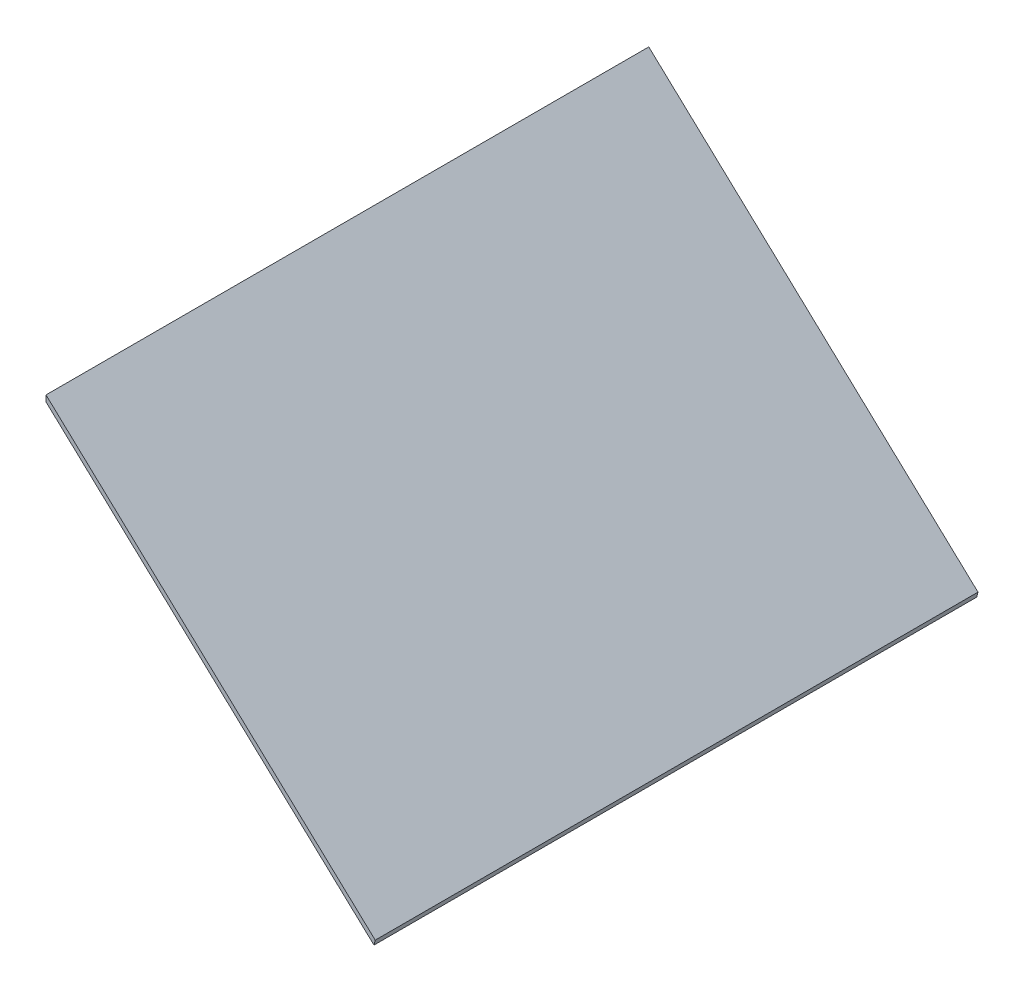
ISO-10303-21;
HEADER;
FILE_DESCRIPTION(('STEP AP214'),'2;1');
FILE_NAME('part.step','',(''),(''),'','','');
FILE_SCHEMA(('AUTOMOTIVE_DESIGN { 1 0 10303 214 1 1 1 1 }'));
ENDSEC;
DATA;
#1=APPLICATION_CONTEXT('core data for automotive mechanical design processes');
#2=APPLICATION_PROTOCOL_DEFINITION('international standard','automotive_design',2000,#1);
#3=PRODUCT_CONTEXT('',#1,'mechanical');
#4=PRODUCT('Part','Part','',(#3));
#5=PRODUCT_RELATED_PRODUCT_CATEGORY('part','',(#4));
#6=PRODUCT_DEFINITION_FORMATION('','',#4);
#7=PRODUCT_DEFINITION_CONTEXT('part definition',#1,'design');
#8=PRODUCT_DEFINITION('design','',#6,#7);
#9=PRODUCT_DEFINITION_SHAPE('','',#8);
#10=(LENGTH_UNIT() NAMED_UNIT(*) SI_UNIT(.MILLI.,.METRE.));
#11=(NAMED_UNIT(*) PLANE_ANGLE_UNIT() SI_UNIT($,.RADIAN.));
#12=(NAMED_UNIT(*) SI_UNIT($,.STERADIAN.) SOLID_ANGLE_UNIT());
#13=UNCERTAINTY_MEASURE_WITH_UNIT(LENGTH_MEASURE(1.E-05),#10,'distance_accuracy_value','');
#14=(GEOMETRIC_REPRESENTATION_CONTEXT(3) GLOBAL_UNCERTAINTY_ASSIGNED_CONTEXT((#13)) GLOBAL_UNIT_ASSIGNED_CONTEXT((#10,
#11,#12)) REPRESENTATION_CONTEXT('',''));
#15=CARTESIAN_POINT('',(0.,0.,0.));
#16=DIRECTION('',(0.,0.,1.));
#17=DIRECTION('',(1.,0.,0.));
#18=AXIS2_PLACEMENT_3D('',#15,#16,#17);
#19=CARTESIAN_POINT('',(272.483044068269,4.08782035649583,498.856));
#20=DIRECTION('',(-0.969817785071793,0.243830809698944,0.));
#21=DIRECTION('',(-0.243830809698944,-0.969817785071793,0.));
#22=AXIS2_PLACEMENT_3D('',#19,#20,#21);
#23=PLANE('',#22);
#24=DIRECTION('',(0.243830809698944,0.969817785071793,0.));
#25=VECTOR('',#24,1.);
#26=CARTESIAN_POINT('',(272.483044068269,4.08782035649583,0.));
#27=LINE('',#26,#25);
#28=CARTESIAN_POINT('',(271.455287552797,0.,0.));
#29=VERTEX_POINT('',#28);
#30=CARTESIAN_POINT('',(272.483044068269,4.08782035649583,0.));
#31=VERTEX_POINT('',#30);
#32=EDGE_CURVE('E96',#29,#31,#27,.T.);
#33=ORIENTED_EDGE('',*,*,#32,.T.);
#34=DIRECTION('',(0.,0.,-1.));
#35=VECTOR('',#34,1.);
#36=CARTESIAN_POINT('',(272.483044068269,4.08782035649583,498.856));
#37=LINE('',#36,#35);
#38=CARTESIAN_POINT('',(272.483044068269,4.08782035649583,498.856));
#39=VERTEX_POINT('',#38);
#40=EDGE_CURVE('E11',#39,#31,#37,.T.);
#41=ORIENTED_EDGE('',*,*,#40,.F.);
#42=DIRECTION('',(0.243830809698944,0.969817785071793,0.));
#43=VECTOR('',#42,1.);
#44=CARTESIAN_POINT('',(272.483044068269,4.08782035649583,498.856));
#45=LINE('',#44,#43);
#46=CARTESIAN_POINT('',(271.455287552797,0.,498.856));
#47=VERTEX_POINT('',#46);
#48=EDGE_CURVE('E84',#47,#39,#45,.T.);
#49=ORIENTED_EDGE('',*,*,#48,.F.);
#50=DIRECTION('',(0.,0.,-1.));
#51=VECTOR('',#50,1.);
#52=CARTESIAN_POINT('',(271.455287552797,0.,498.856));
#53=LINE('',#52,#51);
#54=EDGE_CURVE('E92',#47,#29,#53,.T.);
#55=ORIENTED_EDGE('',*,*,#54,.T.);
#56=EDGE_LOOP('',(#33,#41,#49,#55));
#57=FACE_BOUND('',#56,.T.);
#58=ADVANCED_FACE('F33',(#57),#23,.F.);
#59=CARTESIAN_POINT('',(0.,258.628350398913,498.856));
#60=DIRECTION('',(-0.682637840515917,-0.730756853334791,0.));
#61=DIRECTION('',(0.730756853334791,-0.682637840515917,0.));
#62=AXIS2_PLACEMENT_3D('',#59,#60,#61);
#63=PLANE('',#62);
#64=DIRECTION('',(-0.730756853334791,0.682637840515917,0.));
#65=VECTOR('',#64,1.);
#66=CARTESIAN_POINT('',(0.,258.628350398913,0.));
#67=LINE('',#66,#65);
#68=CARTESIAN_POINT('',(0.,258.628350398913,0.));
#69=VERTEX_POINT('',#68);
#70=EDGE_CURVE('E88',#31,#69,#67,.T.);
#71=ORIENTED_EDGE('',*,*,#70,.T.);
#72=DIRECTION('',(0.,0.,-1.));
#73=VECTOR('',#72,1.);
#74=CARTESIAN_POINT('',(0.,258.628350398913,498.856));
#75=LINE('',#74,#73);
#76=CARTESIAN_POINT('',(0.,258.628350398913,498.856));
#77=VERTEX_POINT('',#76);
#78=EDGE_CURVE('E41',#77,#69,#75,.T.);
#79=ORIENTED_EDGE('',*,*,#78,.F.);
#80=DIRECTION('',(-0.730756853334791,0.682637840515917,0.));
#81=VECTOR('',#80,1.);
#82=CARTESIAN_POINT('',(0.,258.628350398913,498.856));
#83=LINE('',#82,#81);
#84=EDGE_CURVE('E79',#39,#77,#83,.T.);
#85=ORIENTED_EDGE('',*,*,#84,.F.);
#86=ORIENTED_EDGE('',*,*,#40,.T.);
#87=EDGE_LOOP('',(#71,#79,#85,#86));
#88=FACE_BOUND('',#87,.T.);
#89=ADVANCED_FACE('F87',(#88),#63,.F.);
#90=CARTESIAN_POINT('',(0.,253.580449428604,498.856));
#91=DIRECTION('',(1.,0.,0.));
#92=DIRECTION('',(0.,0.,-1.));
#93=AXIS2_PLACEMENT_3D('',#90,#91,#92);
#94=PLANE('',#93);
#95=DIRECTION('',(0.,-1.,0.));
#96=VECTOR('',#95,1.);
#97=CARTESIAN_POINT('',(0.,253.580449428604,0.));
#98=LINE('',#97,#96);
#99=CARTESIAN_POINT('',(0.,253.580449428604,0.));
#100=VERTEX_POINT('',#99);
#101=EDGE_CURVE('E66',#69,#100,#98,.T.);
#102=ORIENTED_EDGE('',*,*,#101,.T.);
#103=DIRECTION('',(0.,0.,-1.));
#104=VECTOR('',#103,1.);
#105=CARTESIAN_POINT('',(0.,253.580449428604,498.856));
#106=LINE('',#105,#104);
#107=CARTESIAN_POINT('',(0.,253.580449428604,498.856));
#108=VERTEX_POINT('',#107);
#109=EDGE_CURVE('E89',#108,#100,#106,.T.);
#110=ORIENTED_EDGE('',*,*,#109,.F.);
#111=DIRECTION('',(0.,-1.,0.));
#112=VECTOR('',#111,1.);
#113=CARTESIAN_POINT('',(0.,253.580449428604,498.856));
#114=LINE('',#113,#112);
#115=EDGE_CURVE('E82',#77,#108,#114,.T.);
#116=ORIENTED_EDGE('',*,*,#115,.F.);
#117=ORIENTED_EDGE('',*,*,#78,.T.);
#118=EDGE_LOOP('',(#102,#110,#116,#117));
#119=FACE_BOUND('',#118,.T.);
#120=ADVANCED_FACE('F90',(#119),#94,.F.);
#121=CARTESIAN_POINT('',(271.455287552797,0.,498.856));
#122=DIRECTION('',(0.682637840515917,0.730756853334791,0.));
#123=DIRECTION('',(-0.730756853334791,0.682637840515917,0.));
#124=AXIS2_PLACEMENT_3D('',#121,#122,#123);
#125=PLANE('',#124);
#126=DIRECTION('',(0.730756853334791,-0.682637840515917,0.));
#127=VECTOR('',#126,1.);
#128=CARTESIAN_POINT('',(271.455287552797,0.,0.));
#129=LINE('',#128,#127);
#130=EDGE_CURVE('E72',#100,#29,#129,.T.);
#131=ORIENTED_EDGE('',*,*,#130,.T.);
#132=ORIENTED_EDGE('',*,*,#54,.F.);
#133=DIRECTION('',(0.730756853334791,-0.682637840515917,0.));
#134=VECTOR('',#133,1.);
#135=CARTESIAN_POINT('',(271.455287552797,0.,498.856));
#136=LINE('',#135,#134);
#137=EDGE_CURVE('E49',#108,#47,#136,.T.);
#138=ORIENTED_EDGE('',*,*,#137,.F.);
#139=ORIENTED_EDGE('',*,*,#109,.T.);
#140=EDGE_LOOP('',(#131,#132,#138,#139));
#141=FACE_BOUND('',#140,.T.);
#142=ADVANCED_FACE('F103',(#141),#125,.F.);
#143=CARTESIAN_POINT('',(0.,0.,498.856));
#144=DIRECTION('',(0.,0.,-1.));
#145=DIRECTION('',(-1.,0.,0.));
#146=AXIS2_PLACEMENT_3D('',#143,#144,#145);
#147=PLANE('',#146);
#148=ORIENTED_EDGE('',*,*,#48,.T.);
#149=ORIENTED_EDGE('',*,*,#84,.T.);
#150=ORIENTED_EDGE('',*,*,#115,.T.);
#151=ORIENTED_EDGE('',*,*,#137,.T.);
#152=EDGE_LOOP('',(#148,#149,#150,#151));
#153=FACE_BOUND('',#152,.T.);
#154=ADVANCED_FACE('F80',(#153),#147,.F.);
#155=CARTESIAN_POINT('',(0.,0.,0.));
#156=DIRECTION('',(0.,0.,-1.));
#157=DIRECTION('',(-1.,0.,0.));
#158=AXIS2_PLACEMENT_3D('',#155,#156,#157);
#159=PLANE('',#158);
#160=ORIENTED_EDGE('',*,*,#32,.F.);
#161=ORIENTED_EDGE('',*,*,#130,.F.);
#162=ORIENTED_EDGE('',*,*,#101,.F.);
#163=ORIENTED_EDGE('',*,*,#70,.F.);
#164=EDGE_LOOP('',(#160,#161,#162,#163));
#165=FACE_BOUND('',#164,.T.);
#166=ADVANCED_FACE('F106',(#165),#159,.T.);
#167=CLOSED_SHELL('',(#58,#89,#120,#142,#154,#166));
#168=MANIFOLD_SOLID_BREP('B2',#167);
#169=ADVANCED_BREP_SHAPE_REPRESENTATION('',(#18,#168),#14);
#170=SHAPE_DEFINITION_REPRESENTATION(#9,#169);
ENDSEC;
END-ISO-10303-21;
